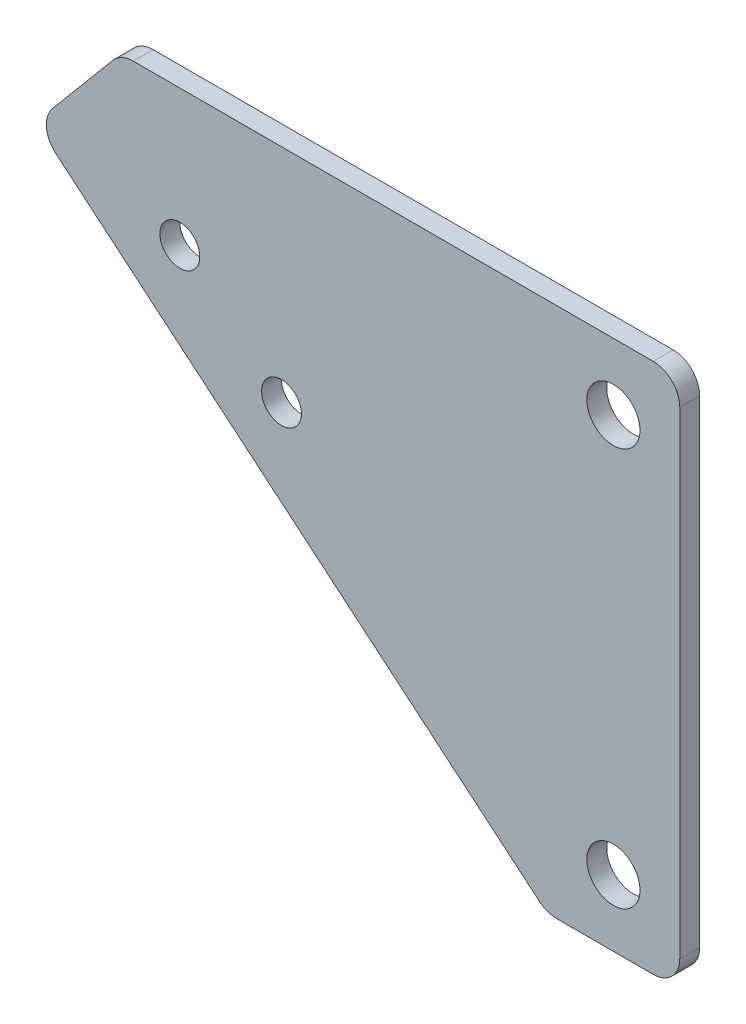
ISO-10303-21;
HEADER;
FILE_DESCRIPTION(('STEP AP214'),'2;1');
FILE_NAME('part.step','',(''),(''),'','','');
FILE_SCHEMA(('AUTOMOTIVE_DESIGN { 1 0 10303 214 1 1 1 1 }'));
ENDSEC;
DATA;
#1=APPLICATION_CONTEXT('core data for automotive mechanical design processes');
#2=APPLICATION_PROTOCOL_DEFINITION('international standard','automotive_design',2000,#1);
#3=PRODUCT_CONTEXT('',#1,'mechanical');
#4=PRODUCT('Part','Part','',(#3));
#5=PRODUCT_RELATED_PRODUCT_CATEGORY('part','',(#4));
#6=PRODUCT_DEFINITION_FORMATION('','',#4);
#7=PRODUCT_DEFINITION_CONTEXT('part definition',#1,'design');
#8=PRODUCT_DEFINITION('design','',#6,#7);
#9=PRODUCT_DEFINITION_SHAPE('','',#8);
#10=(LENGTH_UNIT() NAMED_UNIT(*) SI_UNIT(.MILLI.,.METRE.));
#11=(NAMED_UNIT(*) PLANE_ANGLE_UNIT() SI_UNIT($,.RADIAN.));
#12=(NAMED_UNIT(*) SI_UNIT($,.STERADIAN.) SOLID_ANGLE_UNIT());
#13=UNCERTAINTY_MEASURE_WITH_UNIT(LENGTH_MEASURE(1.E-05),#10,'distance_accuracy_value','');
#14=(GEOMETRIC_REPRESENTATION_CONTEXT(3) GLOBAL_UNCERTAINTY_ASSIGNED_CONTEXT((#13)) GLOBAL_UNIT_ASSIGNED_CONTEXT((#10,
#11,#12)) REPRESENTATION_CONTEXT('',''));
#15=CARTESIAN_POINT('',(0.,0.,0.));
#16=DIRECTION('',(0.,0.,1.));
#17=DIRECTION('',(1.,0.,0.));
#18=AXIS2_PLACEMENT_3D('',#15,#16,#17);
#19=CARTESIAN_POINT('',(0.,0.,1.5));
#20=DIRECTION('',(0.,0.,-1.));
#21=DIRECTION('',(-1.,0.,0.));
#22=AXIS2_PLACEMENT_3D('',#19,#20,#21);
#23=PLANE('',#22);
#24=DIRECTION('',(-0.64278760968654,-0.766044443118977,0.));
#25=VECTOR('',#24,1.);
#26=CARTESIAN_POINT('',(-48.5407815320296,32.3395555688102,1.5));
#27=LINE('',#26,#25);
#28=CARTESIAN_POINT('',(-42.7123790050921,39.2855752193731,1.5));
#29=VERTEX_POINT('',#28);
#30=CARTESIAN_POINT('',(-47.2552063126565,33.8716444550482,1.5));
#31=VERTEX_POINT('',#30);
#32=EDGE_CURVE('E193',#29,#31,#27,.T.);
#33=ORIENTED_EDGE('',*,*,#32,.T.);
#34=CARTESIAN_POINT('',(-45.7231174264185,32.5860692356751,1.5));
#35=DIRECTION('',(0.,0.,-1.));
#36=DIRECTION('',(-1.,0.,0.));
#37=AXIS2_PLACEMENT_3D('',#34,#35,#36);
#38=CIRCLE('',#37,2.);
#39=CARTESIAN_POINT('',(-47.0086926457916,31.0539803494372,1.5));
#40=VERTEX_POINT('',#39);
#41=EDGE_CURVE('E167',#31,#40,#38,.F.);
#42=ORIENTED_EDGE('',*,*,#41,.T.);
#43=DIRECTION('',(0.766044443118977,-0.64278760968654,0.));
#44=VECTOR('',#43,1.);
#45=CARTESIAN_POINT('',(-10.,0.,1.5));
#46=LINE('',#45,#44);
#47=CARTESIAN_POINT('',(-10.5576347508407,0.467911113762045,1.5));
#48=VERTEX_POINT('',#47);
#49=EDGE_CURVE('E133',#40,#48,#46,.T.);
#50=ORIENTED_EDGE('',*,*,#49,.T.);
#51=CARTESIAN_POINT('',(-9.27205953146759,2.,1.5));
#52=DIRECTION('',(0.,0.,-1.));
#53=DIRECTION('',(-1.,0.,0.));
#54=AXIS2_PLACEMENT_3D('',#51,#52,#53);
#55=CIRCLE('',#54,2.);
#56=CARTESIAN_POINT('',(-9.27205953146759,0.,1.5));
#57=VERTEX_POINT('',#56);
#58=EDGE_CURVE('E57',#48,#57,#55,.F.);
#59=ORIENTED_EDGE('',*,*,#58,.T.);
#60=DIRECTION('',(1.,0.,0.));
#61=VECTOR('',#60,1.);
#62=CARTESIAN_POINT('',(0.,0.,1.5));
#63=LINE('',#62,#61);
#64=CARTESIAN_POINT('',(-2.,0.,1.5));
#65=VERTEX_POINT('',#64);
#66=EDGE_CURVE('E149',#57,#65,#63,.T.);
#67=ORIENTED_EDGE('',*,*,#66,.T.);
#68=CARTESIAN_POINT('',(-2.,2.,1.5));
#69=DIRECTION('',(0.,0.,-1.));
#70=DIRECTION('',(-1.,0.,0.));
#71=AXIS2_PLACEMENT_3D('',#68,#69,#70);
#72=CIRCLE('',#71,2.);
#73=CARTESIAN_POINT('',(0.,2.,1.5));
#74=VERTEX_POINT('',#73);
#75=EDGE_CURVE('E164',#65,#74,#72,.F.);
#76=ORIENTED_EDGE('',*,*,#75,.T.);
#77=DIRECTION('',(0.,1.,0.));
#78=VECTOR('',#77,1.);
#79=CARTESIAN_POINT('',(0.,40.,1.5));
#80=LINE('',#79,#78);
#81=CARTESIAN_POINT('',(0.,38.,1.5));
#82=VERTEX_POINT('',#81);
#83=EDGE_CURVE('E143',#74,#82,#80,.T.);
#84=ORIENTED_EDGE('',*,*,#83,.T.);
#85=CARTESIAN_POINT('',(-2.,38.,1.5));
#86=DIRECTION('',(0.,0.,-1.));
#87=DIRECTION('',(-1.,0.,0.));
#88=AXIS2_PLACEMENT_3D('',#85,#86,#87);
#89=CIRCLE('',#88,2.);
#90=CARTESIAN_POINT('',(-2.,40.,1.5));
#91=VERTEX_POINT('',#90);
#92=EDGE_CURVE('E162',#82,#91,#89,.F.);
#93=ORIENTED_EDGE('',*,*,#92,.T.);
#94=DIRECTION('',(-1.,0.,0.));
#95=VECTOR('',#94,1.);
#96=CARTESIAN_POINT('',(-42.1129054351642,40.,1.5));
#97=LINE('',#96,#95);
#98=CARTESIAN_POINT('',(-41.1802901188542,40.,1.5));
#99=VERTEX_POINT('',#98);
#100=EDGE_CURVE('E183',#91,#99,#97,.T.);
#101=ORIENTED_EDGE('',*,*,#100,.T.);
#102=CARTESIAN_POINT('',(-41.1802901188542,38.,1.5));
#103=DIRECTION('',(0.,0.,-1.));
#104=DIRECTION('',(-1.,0.,0.));
#105=AXIS2_PLACEMENT_3D('',#102,#103,#104);
#106=CIRCLE('',#105,2.);
#107=EDGE_CURVE('E160',#99,#29,#106,.F.);
#108=ORIENTED_EDGE('',*,*,#107,.T.);
#109=EDGE_LOOP('',(#33,#42,#50,#59,#67,#76,#84,#93,#101,#108));
#110=FACE_BOUND('',#109,.T.);
#111=CARTESIAN_POINT('',(-37.6663990524071,29.7419016875397,1.5));
#112=DIRECTION('',(0.,0.,1.));
#113=DIRECTION('',(1.,0.,0.));
#114=AXIS2_PLACEMENT_3D('',#111,#112,#113);
#115=CIRCLE('',#114,1.5);
#116=CARTESIAN_POINT('',(-36.1663990524071,29.7419016875397,1.5));
#117=VERTEX_POINT('',#116);
#118=EDGE_CURVE('E201',#117,#117,#115,.T.);
#119=ORIENTED_EDGE('',*,*,#118,.F.);
#120=EDGE_LOOP('',(#119));
#121=FACE_BOUND('',#120,.T.);
#122=CARTESIAN_POINT('',(-30.0059546212173,23.3140255906743,1.5));
#123=DIRECTION('',(0.,0.,1.));
#124=DIRECTION('',(1.,0.,0.));
#125=AXIS2_PLACEMENT_3D('',#122,#123,#124);
#126=CIRCLE('',#125,1.5);
#127=CARTESIAN_POINT('',(-28.5059546212173,23.3140255906743,1.5));
#128=VERTEX_POINT('',#127);
#129=EDGE_CURVE('E211',#128,#128,#126,.T.);
#130=ORIENTED_EDGE('',*,*,#129,.F.);
#131=EDGE_LOOP('',(#130));
#132=FACE_BOUND('',#131,.T.);
#133=CARTESIAN_POINT('',(-5.,5.,1.5));
#134=DIRECTION('',(0.,0.,1.));
#135=DIRECTION('',(1.,0.,0.));
#136=AXIS2_PLACEMENT_3D('',#133,#134,#135);
#137=CIRCLE('',#136,2.);
#138=CARTESIAN_POINT('',(-3.,5.,1.5));
#139=VERTEX_POINT('',#138);
#140=EDGE_CURVE('E217',#139,#139,#137,.T.);
#141=ORIENTED_EDGE('',*,*,#140,.F.);
#142=EDGE_LOOP('',(#141));
#143=FACE_BOUND('',#142,.T.);
#144=CARTESIAN_POINT('',(-5.,35.,1.5));
#145=DIRECTION('',(0.,0.,1.));
#146=DIRECTION('',(1.,0.,0.));
#147=AXIS2_PLACEMENT_3D('',#144,#145,#146);
#148=CIRCLE('',#147,2.);
#149=CARTESIAN_POINT('',(-2.99999999999999,35.,1.5));
#150=VERTEX_POINT('',#149);
#151=EDGE_CURVE('E223',#150,#150,#148,.T.);
#152=ORIENTED_EDGE('',*,*,#151,.F.);
#153=EDGE_LOOP('',(#152));
#154=FACE_BOUND('',#153,.T.);
#155=ADVANCED_FACE('F35',(#110,#121,#132,#143,#154),#23,.F.);
#156=CARTESIAN_POINT('',(0.,0.,0.));
#157=DIRECTION('',(0.,0.,-1.));
#158=DIRECTION('',(-1.,0.,0.));
#159=AXIS2_PLACEMENT_3D('',#156,#157,#158);
#160=PLANE('',#159);
#161=CARTESIAN_POINT('',(-5.,5.,0.));
#162=DIRECTION('',(0.,0.,1.));
#163=DIRECTION('',(1.,0.,0.));
#164=AXIS2_PLACEMENT_3D('',#161,#162,#163);
#165=CIRCLE('',#164,2.);
#166=CARTESIAN_POINT('',(-3.,5.,0.));
#167=VERTEX_POINT('',#166);
#168=EDGE_CURVE('E220',#167,#167,#165,.T.);
#169=ORIENTED_EDGE('',*,*,#168,.T.);
#170=EDGE_LOOP('',(#169));
#171=FACE_BOUND('',#170,.T.);
#172=CARTESIAN_POINT('',(-37.6663990524071,29.7419016875397,0.));
#173=DIRECTION('',(0.,0.,1.));
#174=DIRECTION('',(1.,0.,0.));
#175=AXIS2_PLACEMENT_3D('',#172,#173,#174);
#176=CIRCLE('',#175,1.5);
#177=CARTESIAN_POINT('',(-36.1663990524071,29.7419016875397,0.));
#178=VERTEX_POINT('',#177);
#179=EDGE_CURVE('E208',#178,#178,#176,.T.);
#180=ORIENTED_EDGE('',*,*,#179,.T.);
#181=EDGE_LOOP('',(#180));
#182=FACE_BOUND('',#181,.T.);
#183=DIRECTION('',(0.766044443118977,-0.64278760968654,0.));
#184=VECTOR('',#183,1.);
#185=CARTESIAN_POINT('',(-10.,0.,0.));
#186=LINE('',#185,#184);
#187=CARTESIAN_POINT('',(-47.0086926457916,31.0539803494372,0.));
#188=VERTEX_POINT('',#187);
#189=CARTESIAN_POINT('',(-10.5576347508407,0.467911113762045,0.));
#190=VERTEX_POINT('',#189);
#191=EDGE_CURVE('E131',#188,#190,#186,.T.);
#192=ORIENTED_EDGE('',*,*,#191,.F.);
#193=CARTESIAN_POINT('',(-45.7231174264185,32.5860692356751,0.));
#194=DIRECTION('',(0.,0.,-1.));
#195=DIRECTION('',(-1.,0.,0.));
#196=AXIS2_PLACEMENT_3D('',#193,#194,#195);
#197=CIRCLE('',#196,2.);
#198=CARTESIAN_POINT('',(-47.2552063126565,33.8716444550482,0.));
#199=VERTEX_POINT('',#198);
#200=EDGE_CURVE('E114',#188,#199,#197,.T.);
#201=ORIENTED_EDGE('',*,*,#200,.T.);
#202=DIRECTION('',(-0.64278760968654,-0.766044443118977,0.));
#203=VECTOR('',#202,1.);
#204=CARTESIAN_POINT('',(-48.5407815320296,32.3395555688102,0.));
#205=LINE('',#204,#203);
#206=CARTESIAN_POINT('',(-42.7123790050921,39.2855752193731,0.));
#207=VERTEX_POINT('',#206);
#208=EDGE_CURVE('E141',#207,#199,#205,.T.);
#209=ORIENTED_EDGE('',*,*,#208,.F.);
#210=CARTESIAN_POINT('',(-41.1802901188542,38.,0.));
#211=DIRECTION('',(0.,0.,-1.));
#212=DIRECTION('',(-1.,0.,0.));
#213=AXIS2_PLACEMENT_3D('',#210,#211,#212);
#214=CIRCLE('',#213,2.);
#215=CARTESIAN_POINT('',(-41.1802901188542,40.,0.));
#216=VERTEX_POINT('',#215);
#217=EDGE_CURVE('E134',#207,#216,#214,.T.);
#218=ORIENTED_EDGE('',*,*,#217,.T.);
#219=DIRECTION('',(-1.,0.,0.));
#220=VECTOR('',#219,1.);
#221=CARTESIAN_POINT('',(-42.1129054351642,40.,0.));
#222=LINE('',#221,#220);
#223=CARTESIAN_POINT('',(-2.,40.,0.));
#224=VERTEX_POINT('',#223);
#225=EDGE_CURVE('E145',#224,#216,#222,.T.);
#226=ORIENTED_EDGE('',*,*,#225,.F.);
#227=CARTESIAN_POINT('',(-2.,38.,0.));
#228=DIRECTION('',(0.,0.,-1.));
#229=DIRECTION('',(-1.,0.,0.));
#230=AXIS2_PLACEMENT_3D('',#227,#228,#229);
#231=CIRCLE('',#230,2.);
#232=CARTESIAN_POINT('',(0.,38.,0.));
#233=VERTEX_POINT('',#232);
#234=EDGE_CURVE('E152',#224,#233,#231,.T.);
#235=ORIENTED_EDGE('',*,*,#234,.T.);
#236=DIRECTION('',(0.,1.,0.));
#237=VECTOR('',#236,1.);
#238=CARTESIAN_POINT('',(0.,40.,0.));
#239=LINE('',#238,#237);
#240=CARTESIAN_POINT('',(0.,2.,0.));
#241=VERTEX_POINT('',#240);
#242=EDGE_CURVE('E200',#241,#233,#239,.T.);
#243=ORIENTED_EDGE('',*,*,#242,.F.);
#244=CARTESIAN_POINT('',(-2.,2.,0.));
#245=DIRECTION('',(0.,0.,-1.));
#246=DIRECTION('',(-1.,0.,0.));
#247=AXIS2_PLACEMENT_3D('',#244,#245,#246);
#248=CIRCLE('',#247,2.);
#249=CARTESIAN_POINT('',(-2.,0.,0.));
#250=VERTEX_POINT('',#249);
#251=EDGE_CURVE('E154',#241,#250,#248,.T.);
#252=ORIENTED_EDGE('',*,*,#251,.T.);
#253=DIRECTION('',(1.,0.,0.));
#254=VECTOR('',#253,1.);
#255=CARTESIAN_POINT('',(0.,0.,0.));
#256=LINE('',#255,#254);
#257=CARTESIAN_POINT('',(-9.27205953146759,0.,0.));
#258=VERTEX_POINT('',#257);
#259=EDGE_CURVE('E140',#258,#250,#256,.T.);
#260=ORIENTED_EDGE('',*,*,#259,.F.);
#261=CARTESIAN_POINT('',(-9.27205953146759,2.,0.));
#262=DIRECTION('',(0.,0.,-1.));
#263=DIRECTION('',(-1.,0.,0.));
#264=AXIS2_PLACEMENT_3D('',#261,#262,#263);
#265=CIRCLE('',#264,2.);
#266=EDGE_CURVE('E125',#258,#190,#265,.T.);
#267=ORIENTED_EDGE('',*,*,#266,.T.);
#268=EDGE_LOOP('',(#192,#201,#209,#218,#226,#235,#243,#252,#260,#267));
#269=FACE_BOUND('',#268,.T.);
#270=CARTESIAN_POINT('',(-30.0059546212173,23.3140255906743,0.));
#271=DIRECTION('',(0.,0.,1.));
#272=DIRECTION('',(1.,0.,0.));
#273=AXIS2_PLACEMENT_3D('',#270,#271,#272);
#274=CIRCLE('',#273,1.5);
#275=CARTESIAN_POINT('',(-28.5059546212173,23.3140255906743,0.));
#276=VERTEX_POINT('',#275);
#277=EDGE_CURVE('E214',#276,#276,#274,.T.);
#278=ORIENTED_EDGE('',*,*,#277,.T.);
#279=EDGE_LOOP('',(#278));
#280=FACE_BOUND('',#279,.T.);
#281=CARTESIAN_POINT('',(-5.,35.,0.));
#282=DIRECTION('',(0.,0.,1.));
#283=DIRECTION('',(1.,0.,0.));
#284=AXIS2_PLACEMENT_3D('',#281,#282,#283);
#285=CIRCLE('',#284,2.);
#286=CARTESIAN_POINT('',(-2.99999999999999,35.,0.));
#287=VERTEX_POINT('',#286);
#288=EDGE_CURVE('E226',#287,#287,#285,.T.);
#289=ORIENTED_EDGE('',*,*,#288,.T.);
#290=EDGE_LOOP('',(#289));
#291=FACE_BOUND('',#290,.T.);
#292=ADVANCED_FACE('F137',(#171,#182,#269,#280,#291),#160,.T.);
#293=CARTESIAN_POINT('',(0.,40.,1.5));
#294=DIRECTION('',(-1.,0.,0.));
#295=DIRECTION('',(0.,-1.,0.));
#296=AXIS2_PLACEMENT_3D('',#293,#294,#295);
#297=PLANE('',#296);
#298=ORIENTED_EDGE('',*,*,#83,.F.);
#299=DIRECTION('',(0.,0.,-1.));
#300=VECTOR('',#299,1.);
#301=CARTESIAN_POINT('',(0.,2.,1.5));
#302=LINE('',#301,#300);
#303=EDGE_CURVE('E175',#74,#241,#302,.T.);
#304=ORIENTED_EDGE('',*,*,#303,.T.);
#305=ORIENTED_EDGE('',*,*,#242,.T.);
#306=DIRECTION('',(0.,0.,-1.));
#307=VECTOR('',#306,1.);
#308=CARTESIAN_POINT('',(0.,38.,1.5));
#309=LINE('',#308,#307);
#310=EDGE_CURVE('E173',#233,#82,#309,.F.);
#311=ORIENTED_EDGE('',*,*,#310,.T.);
#312=EDGE_LOOP('',(#298,#304,#305,#311));
#313=FACE_BOUND('',#312,.T.);
#314=ADVANCED_FACE('F240',(#313),#297,.F.);
#315=CARTESIAN_POINT('',(-42.1129054351642,40.,1.5));
#316=DIRECTION('',(0.,-1.,0.));
#317=DIRECTION('',(1.,0.,0.));
#318=AXIS2_PLACEMENT_3D('',#315,#316,#317);
#319=PLANE('',#318);
#320=ORIENTED_EDGE('',*,*,#100,.F.);
#321=DIRECTION('',(0.,0.,-1.));
#322=VECTOR('',#321,1.);
#323=CARTESIAN_POINT('',(-2.,40.,1.5));
#324=LINE('',#323,#322);
#325=EDGE_CURVE('E11',#91,#224,#324,.T.);
#326=ORIENTED_EDGE('',*,*,#325,.T.);
#327=ORIENTED_EDGE('',*,*,#225,.T.);
#328=DIRECTION('',(0.,0.,-1.));
#329=VECTOR('',#328,1.);
#330=CARTESIAN_POINT('',(-41.1802901188542,40.,1.5));
#331=LINE('',#330,#329);
#332=EDGE_CURVE('E43',#216,#99,#331,.F.);
#333=ORIENTED_EDGE('',*,*,#332,.T.);
#334=EDGE_LOOP('',(#320,#326,#327,#333));
#335=FACE_BOUND('',#334,.T.);
#336=ADVANCED_FACE('F182',(#335),#319,.F.);
#337=CARTESIAN_POINT('',(-48.5407815320296,32.3395555688102,1.5));
#338=DIRECTION('',(0.766044443118977,-0.64278760968654,0.));
#339=DIRECTION('',(0.64278760968654,0.766044443118977,0.));
#340=AXIS2_PLACEMENT_3D('',#337,#338,#339);
#341=PLANE('',#340);
#342=ORIENTED_EDGE('',*,*,#208,.T.);
#343=DIRECTION('',(0.,0.,-1.));
#344=VECTOR('',#343,1.);
#345=CARTESIAN_POINT('',(-47.2552063126565,33.8716444550482,1.5));
#346=LINE('',#345,#344);
#347=EDGE_CURVE('E119',#199,#31,#346,.F.);
#348=ORIENTED_EDGE('',*,*,#347,.T.);
#349=ORIENTED_EDGE('',*,*,#32,.F.);
#350=DIRECTION('',(0.,0.,-1.));
#351=VECTOR('',#350,1.);
#352=CARTESIAN_POINT('',(-42.7123790050921,39.2855752193731,1.5));
#353=LINE('',#352,#351);
#354=EDGE_CURVE('E124',#29,#207,#353,.T.);
#355=ORIENTED_EDGE('',*,*,#354,.T.);
#356=EDGE_LOOP('',(#342,#348,#349,#355));
#357=FACE_BOUND('',#356,.T.);
#358=ADVANCED_FACE('F197',(#357),#341,.F.);
#359=CARTESIAN_POINT('',(-10.,0.,1.5));
#360=DIRECTION('',(0.64278760968654,0.766044443118977,0.));
#361=DIRECTION('',(-0.766044443118977,0.64278760968654,0.));
#362=AXIS2_PLACEMENT_3D('',#359,#360,#361);
#363=PLANE('',#362);
#364=ORIENTED_EDGE('',*,*,#49,.F.);
#365=DIRECTION('',(0.,0.,-1.));
#366=VECTOR('',#365,1.);
#367=CARTESIAN_POINT('',(-47.0086926457916,31.0539803494372,1.5));
#368=LINE('',#367,#366);
#369=EDGE_CURVE('E118',#40,#188,#368,.T.);
#370=ORIENTED_EDGE('',*,*,#369,.T.);
#371=ORIENTED_EDGE('',*,*,#191,.T.);
#372=DIRECTION('',(0.,0.,-1.));
#373=VECTOR('',#372,1.);
#374=CARTESIAN_POINT('',(-10.5576347508407,0.467911113762045,1.5));
#375=LINE('',#374,#373);
#376=EDGE_CURVE('E135',#190,#48,#375,.F.);
#377=ORIENTED_EDGE('',*,*,#376,.T.);
#378=EDGE_LOOP('',(#364,#370,#371,#377));
#379=FACE_BOUND('',#378,.T.);
#380=ADVANCED_FACE('F130',(#379),#363,.F.);
#381=CARTESIAN_POINT('',(0.,0.,1.5));
#382=DIRECTION('',(0.,1.,0.));
#383=DIRECTION('',(0.,0.,1.));
#384=AXIS2_PLACEMENT_3D('',#381,#382,#383);
#385=PLANE('',#384);
#386=ORIENTED_EDGE('',*,*,#66,.F.);
#387=DIRECTION('',(0.,0.,-1.));
#388=VECTOR('',#387,1.);
#389=CARTESIAN_POINT('',(-9.27205953146759,0.,1.5));
#390=LINE('',#389,#388);
#391=EDGE_CURVE('E170',#57,#258,#390,.T.);
#392=ORIENTED_EDGE('',*,*,#391,.T.);
#393=ORIENTED_EDGE('',*,*,#259,.T.);
#394=DIRECTION('',(0.,0.,-1.));
#395=VECTOR('',#394,1.);
#396=CARTESIAN_POINT('',(-2.,0.,1.5));
#397=LINE('',#396,#395);
#398=EDGE_CURVE('E50',#250,#65,#397,.F.);
#399=ORIENTED_EDGE('',*,*,#398,.T.);
#400=EDGE_LOOP('',(#386,#392,#393,#399));
#401=FACE_BOUND('',#400,.T.);
#402=ADVANCED_FACE('F247',(#401),#385,.F.);
#403=CARTESIAN_POINT('',(-37.6663990524071,29.7419016875397,1.5));
#404=DIRECTION('',(0.,0.,-1.));
#405=DIRECTION('',(-1.,0.,0.));
#406=AXIS2_PLACEMENT_3D('',#403,#404,#405);
#407=CYLINDRICAL_SURFACE('',#406,1.5);
#408=ORIENTED_EDGE('',*,*,#118,.T.);
#409=EDGE_LOOP('',(#408));
#410=FACE_BOUND('',#409,.T.);
#411=ORIENTED_EDGE('',*,*,#179,.F.);
#412=EDGE_LOOP('',(#411));
#413=FACE_BOUND('',#412,.T.);
#414=ADVANCED_FACE('F244',(#410,#413),#407,.F.);
#415=CARTESIAN_POINT('',(-30.0059546212173,23.3140255906743,1.5));
#416=DIRECTION('',(0.,0.,-1.));
#417=DIRECTION('',(-1.,0.,0.));
#418=AXIS2_PLACEMENT_3D('',#415,#416,#417);
#419=CYLINDRICAL_SURFACE('',#418,1.5);
#420=ORIENTED_EDGE('',*,*,#129,.T.);
#421=EDGE_LOOP('',(#420));
#422=FACE_BOUND('',#421,.T.);
#423=ORIENTED_EDGE('',*,*,#277,.F.);
#424=EDGE_LOOP('',(#423));
#425=FACE_BOUND('',#424,.T.);
#426=ADVANCED_FACE('F363',(#422,#425),#419,.F.);
#427=CARTESIAN_POINT('',(-5.,5.,1.5));
#428=DIRECTION('',(0.,0.,-1.));
#429=DIRECTION('',(-1.,0.,0.));
#430=AXIS2_PLACEMENT_3D('',#427,#428,#429);
#431=CYLINDRICAL_SURFACE('',#430,2.);
#432=ORIENTED_EDGE('',*,*,#140,.T.);
#433=EDGE_LOOP('',(#432));
#434=FACE_BOUND('',#433,.T.);
#435=ORIENTED_EDGE('',*,*,#168,.F.);
#436=EDGE_LOOP('',(#435));
#437=FACE_BOUND('',#436,.T.);
#438=ADVANCED_FACE('F354',(#434,#437),#431,.F.);
#439=CARTESIAN_POINT('',(-5.,35.,1.5));
#440=DIRECTION('',(0.,0.,-1.));
#441=DIRECTION('',(-1.,0.,0.));
#442=AXIS2_PLACEMENT_3D('',#439,#440,#441);
#443=CYLINDRICAL_SURFACE('',#442,2.);
#444=ORIENTED_EDGE('',*,*,#151,.T.);
#445=EDGE_LOOP('',(#444));
#446=FACE_BOUND('',#445,.T.);
#447=ORIENTED_EDGE('',*,*,#288,.F.);
#448=EDGE_LOOP('',(#447));
#449=FACE_BOUND('',#448,.T.);
#450=ADVANCED_FACE('F232',(#446,#449),#443,.F.);
#451=CARTESIAN_POINT('',(-45.7231174264185,32.5860692356751,1.5));
#452=DIRECTION('',(0.,0.,-1.));
#453=DIRECTION('',(-1.,0.,0.));
#454=AXIS2_PLACEMENT_3D('',#451,#452,#453);
#455=CYLINDRICAL_SURFACE('',#454,2.);
#456=ORIENTED_EDGE('',*,*,#41,.F.);
#457=ORIENTED_EDGE('',*,*,#347,.F.);
#458=ORIENTED_EDGE('',*,*,#200,.F.);
#459=ORIENTED_EDGE('',*,*,#369,.F.);
#460=EDGE_LOOP('',(#456,#457,#458,#459));
#461=FACE_BOUND('',#460,.T.);
#462=ADVANCED_FACE('F117',(#461),#455,.T.);
#463=CARTESIAN_POINT('',(-9.27205953146759,2.,1.5));
#464=DIRECTION('',(0.,0.,-1.));
#465=DIRECTION('',(-1.,0.,0.));
#466=AXIS2_PLACEMENT_3D('',#463,#464,#465);
#467=CYLINDRICAL_SURFACE('',#466,2.);
#468=ORIENTED_EDGE('',*,*,#58,.F.);
#469=ORIENTED_EDGE('',*,*,#376,.F.);
#470=ORIENTED_EDGE('',*,*,#266,.F.);
#471=ORIENTED_EDGE('',*,*,#391,.F.);
#472=EDGE_LOOP('',(#468,#469,#470,#471));
#473=FACE_BOUND('',#472,.T.);
#474=ADVANCED_FACE('F261',(#473),#467,.T.);
#475=CARTESIAN_POINT('',(-2.,2.,1.5));
#476=DIRECTION('',(0.,0.,-1.));
#477=DIRECTION('',(-1.,0.,0.));
#478=AXIS2_PLACEMENT_3D('',#475,#476,#477);
#479=CYLINDRICAL_SURFACE('',#478,2.);
#480=ORIENTED_EDGE('',*,*,#75,.F.);
#481=ORIENTED_EDGE('',*,*,#398,.F.);
#482=ORIENTED_EDGE('',*,*,#251,.F.);
#483=ORIENTED_EDGE('',*,*,#303,.F.);
#484=EDGE_LOOP('',(#480,#481,#482,#483));
#485=FACE_BOUND('',#484,.T.);
#486=ADVANCED_FACE('F264',(#485),#479,.T.);
#487=CARTESIAN_POINT('',(-2.,38.,1.5));
#488=DIRECTION('',(0.,0.,-1.));
#489=DIRECTION('',(-1.,0.,0.));
#490=AXIS2_PLACEMENT_3D('',#487,#488,#489);
#491=CYLINDRICAL_SURFACE('',#490,2.);
#492=ORIENTED_EDGE('',*,*,#92,.F.);
#493=ORIENTED_EDGE('',*,*,#310,.F.);
#494=ORIENTED_EDGE('',*,*,#234,.F.);
#495=ORIENTED_EDGE('',*,*,#325,.F.);
#496=EDGE_LOOP('',(#492,#493,#494,#495));
#497=FACE_BOUND('',#496,.T.);
#498=ADVANCED_FACE('F267',(#497),#491,.T.);
#499=CARTESIAN_POINT('',(-41.1802901188542,38.,1.5));
#500=DIRECTION('',(0.,0.,-1.));
#501=DIRECTION('',(-1.,0.,0.));
#502=AXIS2_PLACEMENT_3D('',#499,#500,#501);
#503=CYLINDRICAL_SURFACE('',#502,2.);
#504=ORIENTED_EDGE('',*,*,#107,.F.);
#505=ORIENTED_EDGE('',*,*,#332,.F.);
#506=ORIENTED_EDGE('',*,*,#217,.F.);
#507=ORIENTED_EDGE('',*,*,#354,.F.);
#508=EDGE_LOOP('',(#504,#505,#506,#507));
#509=FACE_BOUND('',#508,.T.);
#510=ADVANCED_FACE('F37',(#509),#503,.T.);
#511=CLOSED_SHELL('',(#155,#292,#314,#336,#358,#380,#402,#414,#426,#438,#450,#462,#474,#486,
#498,#510));
#512=MANIFOLD_SOLID_BREP('B2',#511);
#513=ADVANCED_BREP_SHAPE_REPRESENTATION('',(#18,#512),#14);
#514=SHAPE_DEFINITION_REPRESENTATION(#9,#513);
ENDSEC;
END-ISO-10303-21;
